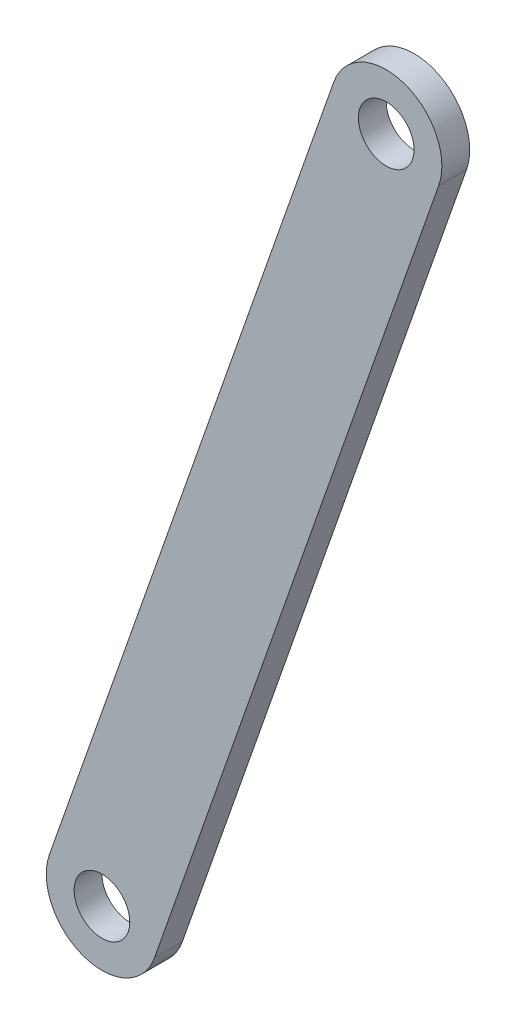
ISO-10303-21;
HEADER;
FILE_DESCRIPTION(('STEP AP214'),'2;1');
FILE_NAME('part.step','',(''),(''),'','','');
FILE_SCHEMA(('AUTOMOTIVE_DESIGN { 1 0 10303 214 1 1 1 1 }'));
ENDSEC;
DATA;
#1=APPLICATION_CONTEXT('core data for automotive mechanical design processes');
#2=APPLICATION_PROTOCOL_DEFINITION('international standard','automotive_design',2000,#1);
#3=PRODUCT_CONTEXT('',#1,'mechanical');
#4=PRODUCT('Part','Part','',(#3));
#5=PRODUCT_RELATED_PRODUCT_CATEGORY('part','',(#4));
#6=PRODUCT_DEFINITION_FORMATION('','',#4);
#7=PRODUCT_DEFINITION_CONTEXT('part definition',#1,'design');
#8=PRODUCT_DEFINITION('design','',#6,#7);
#9=PRODUCT_DEFINITION_SHAPE('','',#8);
#10=(LENGTH_UNIT() NAMED_UNIT(*) SI_UNIT(.MILLI.,.METRE.));
#11=(NAMED_UNIT(*) PLANE_ANGLE_UNIT() SI_UNIT($,.RADIAN.));
#12=(NAMED_UNIT(*) SI_UNIT($,.STERADIAN.) SOLID_ANGLE_UNIT());
#13=UNCERTAINTY_MEASURE_WITH_UNIT(LENGTH_MEASURE(1.E-05),#10,'distance_accuracy_value','');
#14=(GEOMETRIC_REPRESENTATION_CONTEXT(3) GLOBAL_UNCERTAINTY_ASSIGNED_CONTEXT((#13)) GLOBAL_UNIT_ASSIGNED_CONTEXT((#10,
#11,#12)) REPRESENTATION_CONTEXT('',''));
#15=CARTESIAN_POINT('',(0.,0.,0.));
#16=DIRECTION('',(0.,0.,1.));
#17=DIRECTION('',(1.,0.,0.));
#18=AXIS2_PLACEMENT_3D('',#15,#16,#17);
#19=CARTESIAN_POINT('',(-26.9521070315729,-45.5151701700811,-3.175));
#20=DIRECTION('',(0.,0.,1.));
#21=DIRECTION('',(1.,0.,0.));
#22=AXIS2_PLACEMENT_3D('',#19,#20,#21);
#23=CYLINDRICAL_SURFACE('',#22,3.175);
#24=CARTESIAN_POINT('',(-26.9521070315729,-45.5151701700811,-1.5875));
#25=DIRECTION('',(0.,0.,1.));
#26=DIRECTION('',(1.,0.,0.));
#27=AXIS2_PLACEMENT_3D('',#24,#25,#26);
#28=CIRCLE('',#27,3.175);
#29=CARTESIAN_POINT('',(-23.9558295468702,-46.5653826412809,-1.5875));
#30=VERTEX_POINT('',#29);
#31=CARTESIAN_POINT('',(-29.9483845162756,-44.4649576988814,-1.5875));
#32=VERTEX_POINT('',#31);
#33=EDGE_CURVE('E99',#30,#32,#28,.T.);
#34=ORIENTED_EDGE('',*,*,#33,.F.);
#35=DIRECTION('',(0.,0.,1.));
#36=VECTOR('',#35,1.);
#37=CARTESIAN_POINT('',(-23.9558295468702,-46.5653826412809,-3.175));
#38=LINE('',#37,#36);
#39=CARTESIAN_POINT('',(-23.9558295468702,-46.5653826412809,-3.175));
#40=VERTEX_POINT('',#39);
#41=EDGE_CURVE('E11',#40,#30,#38,.T.);
#42=ORIENTED_EDGE('',*,*,#41,.F.);
#43=CARTESIAN_POINT('',(-26.9521070315729,-45.5151701700811,-3.175));
#44=DIRECTION('',(0.,0.,1.));
#45=DIRECTION('',(1.,0.,0.));
#46=AXIS2_PLACEMENT_3D('',#43,#44,#45);
#47=CIRCLE('',#46,3.175);
#48=CARTESIAN_POINT('',(-29.9483845162756,-44.4649576988814,-3.175));
#49=VERTEX_POINT('',#48);
#50=EDGE_CURVE('E92',#40,#49,#47,.T.);
#51=ORIENTED_EDGE('',*,*,#50,.T.);
#52=DIRECTION('',(0.,0.,1.));
#53=VECTOR('',#52,1.);
#54=CARTESIAN_POINT('',(-29.9483845162756,-44.4649576988814,-3.175));
#55=LINE('',#54,#53);
#56=EDGE_CURVE('E37',#49,#32,#55,.T.);
#57=ORIENTED_EDGE('',*,*,#56,.T.);
#58=EDGE_LOOP('',(#34,#42,#51,#57));
#59=FACE_BOUND('',#58,.T.);
#60=ADVANCED_FACE('F34',(#59),#23,.T.);
#61=CARTESIAN_POINT('',(-23.9558295468702,-46.5653826412809,-3.175));
#62=DIRECTION('',(0.943709444000859,-0.330775581480239,0.));
#63=DIRECTION('',(0.330775581480239,0.943709444000859,0.));
#64=AXIS2_PLACEMENT_3D('',#61,#62,#63);
#65=PLANE('',#64);
#66=DIRECTION('',(0.330775581480239,0.943709444000859,0.));
#67=VECTOR('',#66,1.);
#68=CARTESIAN_POINT('',(-23.9558295468702,-46.5653826412809,-1.5875));
#69=LINE('',#68,#67);
#70=CARTESIAN_POINT('',(-40.1638330394019,-92.807145397323,-1.5875));
#71=VERTEX_POINT('',#70);
#72=EDGE_CURVE('E94',#71,#30,#69,.T.);
#73=ORIENTED_EDGE('',*,*,#72,.F.);
#74=DIRECTION('',(0.,0.,1.));
#75=VECTOR('',#74,1.);
#76=CARTESIAN_POINT('',(-40.1638330394019,-92.807145397323,-3.175));
#77=LINE('',#76,#75);
#78=CARTESIAN_POINT('',(-40.1638330394019,-92.807145397323,-3.175));
#79=VERTEX_POINT('',#78);
#80=EDGE_CURVE('E43',#79,#71,#77,.T.);
#81=ORIENTED_EDGE('',*,*,#80,.F.);
#82=DIRECTION('',(0.330775581480239,0.943709444000859,0.));
#83=VECTOR('',#82,1.);
#84=CARTESIAN_POINT('',(-23.9558295468702,-46.5653826412809,-3.175));
#85=LINE('',#84,#83);
#86=EDGE_CURVE('E89',#79,#40,#85,.T.);
#87=ORIENTED_EDGE('',*,*,#86,.T.);
#88=ORIENTED_EDGE('',*,*,#41,.T.);
#89=EDGE_LOOP('',(#73,#81,#87,#88));
#90=FACE_BOUND('',#89,.T.);
#91=ADVANCED_FACE('F110',(#90),#65,.T.);
#92=CARTESIAN_POINT('',(-43.1601105241046,-91.7569329261232,-3.175));
#93=DIRECTION('',(0.,0.,1.));
#94=DIRECTION('',(1.,0.,0.));
#95=AXIS2_PLACEMENT_3D('',#92,#93,#94);
#96=CYLINDRICAL_SURFACE('',#95,3.17499999999999);
#97=CARTESIAN_POINT('',(-43.1601105241046,-91.7569329261232,-1.5875));
#98=DIRECTION('',(0.,0.,1.));
#99=DIRECTION('',(1.,0.,0.));
#100=AXIS2_PLACEMENT_3D('',#97,#98,#99);
#101=CIRCLE('',#100,3.17499999999999);
#102=CARTESIAN_POINT('',(-46.1563880088073,-90.7067204549235,-1.5875));
#103=VERTEX_POINT('',#102);
#104=EDGE_CURVE('E84',#103,#71,#101,.T.);
#105=ORIENTED_EDGE('',*,*,#104,.F.);
#106=DIRECTION('',(0.,0.,1.));
#107=VECTOR('',#106,1.);
#108=CARTESIAN_POINT('',(-46.1563880088073,-90.7067204549235,-3.175));
#109=LINE('',#108,#107);
#110=CARTESIAN_POINT('',(-46.1563880088073,-90.7067204549235,-3.175));
#111=VERTEX_POINT('',#110);
#112=EDGE_CURVE('E79',#111,#103,#109,.T.);
#113=ORIENTED_EDGE('',*,*,#112,.F.);
#114=CARTESIAN_POINT('',(-43.1601105241046,-91.7569329261232,-3.175));
#115=DIRECTION('',(0.,0.,1.));
#116=DIRECTION('',(1.,0.,0.));
#117=AXIS2_PLACEMENT_3D('',#114,#115,#116);
#118=CIRCLE('',#117,3.17499999999999);
#119=EDGE_CURVE('E82',#111,#79,#118,.T.);
#120=ORIENTED_EDGE('',*,*,#119,.T.);
#121=ORIENTED_EDGE('',*,*,#80,.T.);
#122=EDGE_LOOP('',(#105,#113,#120,#121));
#123=FACE_BOUND('',#122,.T.);
#124=ADVANCED_FACE('F81',(#123),#96,.T.);
#125=CARTESIAN_POINT('',(-29.9483845162756,-44.4649576988814,-3.175));
#126=DIRECTION('',(-0.943709444000859,0.330775581480239,0.));
#127=DIRECTION('',(-0.330775581480239,-0.943709444000859,0.));
#128=AXIS2_PLACEMENT_3D('',#125,#126,#127);
#129=PLANE('',#128);
#130=DIRECTION('',(-0.330775581480239,-0.943709444000859,0.));
#131=VECTOR('',#130,1.);
#132=CARTESIAN_POINT('',(-29.9483845162756,-44.4649576988814,-1.5875));
#133=LINE('',#132,#131);
#134=EDGE_CURVE('E102',#32,#103,#133,.T.);
#135=ORIENTED_EDGE('',*,*,#134,.F.);
#136=ORIENTED_EDGE('',*,*,#56,.F.);
#137=DIRECTION('',(-0.330775581480239,-0.943709444000859,0.));
#138=VECTOR('',#137,1.);
#139=CARTESIAN_POINT('',(-29.9483845162756,-44.4649576988814,-3.175));
#140=LINE('',#139,#138);
#141=EDGE_CURVE('E88',#49,#111,#140,.T.);
#142=ORIENTED_EDGE('',*,*,#141,.T.);
#143=ORIENTED_EDGE('',*,*,#112,.T.);
#144=EDGE_LOOP('',(#135,#136,#142,#143));
#145=FACE_BOUND('',#144,.T.);
#146=ADVANCED_FACE('F91',(#145),#129,.T.);
#147=CARTESIAN_POINT('',(-26.9521070315729,-45.5151701700811,-3.175));
#148=DIRECTION('',(0.,0.,1.));
#149=DIRECTION('',(1.,0.,0.));
#150=AXIS2_PLACEMENT_3D('',#147,#148,#149);
#151=PLANE('',#150);
#152=CARTESIAN_POINT('',(-26.9521070315729,-45.5151701700811,-3.175));
#153=DIRECTION('',(0.,0.,1.));
#154=DIRECTION('',(1.,0.,0.));
#155=AXIS2_PLACEMENT_3D('',#152,#153,#154);
#156=CIRCLE('',#155,1.5875);
#157=CARTESIAN_POINT('',(-25.3646070315729,-45.5151701700811,-3.175));
#158=VERTEX_POINT('',#157);
#159=EDGE_CURVE('E143',#158,#158,#156,.T.);
#160=ORIENTED_EDGE('',*,*,#159,.T.);
#161=EDGE_LOOP('',(#160));
#162=FACE_BOUND('',#161,.T.);
#163=CARTESIAN_POINT('',(-43.1601105241046,-91.7569329261232,-3.175));
#164=DIRECTION('',(0.,0.,1.));
#165=DIRECTION('',(1.,0.,0.));
#166=AXIS2_PLACEMENT_3D('',#163,#164,#165);
#167=CIRCLE('',#166,1.5875);
#168=CARTESIAN_POINT('',(-41.5726105241046,-91.7569329261232,-3.175));
#169=VERTEX_POINT('',#168);
#170=EDGE_CURVE('E103',#169,#169,#167,.T.);
#171=ORIENTED_EDGE('',*,*,#170,.T.);
#172=EDGE_LOOP('',(#171));
#173=FACE_BOUND('',#172,.T.);
#174=ORIENTED_EDGE('',*,*,#50,.F.);
#175=ORIENTED_EDGE('',*,*,#86,.F.);
#176=ORIENTED_EDGE('',*,*,#119,.F.);
#177=ORIENTED_EDGE('',*,*,#141,.F.);
#178=EDGE_LOOP('',(#174,#175,#176,#177));
#179=FACE_BOUND('',#178,.T.);
#180=ADVANCED_FACE('F87',(#162,#173,#179),#151,.F.);
#181=CARTESIAN_POINT('',(-26.9521070315729,-45.5151701700811,-1.5875));
#182=DIRECTION('',(0.,0.,1.));
#183=DIRECTION('',(1.,0.,0.));
#184=AXIS2_PLACEMENT_3D('',#181,#182,#183);
#185=PLANE('',#184);
#186=CARTESIAN_POINT('',(-26.9521070315729,-45.5151701700811,-1.5875));
#187=DIRECTION('',(0.,0.,1.));
#188=DIRECTION('',(1.,0.,0.));
#189=AXIS2_PLACEMENT_3D('',#186,#187,#188);
#190=CIRCLE('',#189,1.5875);
#191=CARTESIAN_POINT('',(-25.3646070315729,-45.5151701700811,-1.5875));
#192=VERTEX_POINT('',#191);
#193=EDGE_CURVE('E146',#192,#192,#190,.T.);
#194=ORIENTED_EDGE('',*,*,#193,.F.);
#195=EDGE_LOOP('',(#194));
#196=FACE_BOUND('',#195,.T.);
#197=CARTESIAN_POINT('',(-43.1601105241046,-91.7569329261232,-1.5875));
#198=DIRECTION('',(0.,0.,1.));
#199=DIRECTION('',(1.,0.,0.));
#200=AXIS2_PLACEMENT_3D('',#197,#198,#199);
#201=CIRCLE('',#200,1.5875);
#202=CARTESIAN_POINT('',(-41.5726105241046,-91.7569329261232,-1.5875));
#203=VERTEX_POINT('',#202);
#204=EDGE_CURVE('E148',#203,#203,#201,.T.);
#205=ORIENTED_EDGE('',*,*,#204,.F.);
#206=EDGE_LOOP('',(#205));
#207=FACE_BOUND('',#206,.T.);
#208=ORIENTED_EDGE('',*,*,#33,.T.);
#209=ORIENTED_EDGE('',*,*,#134,.T.);
#210=ORIENTED_EDGE('',*,*,#104,.T.);
#211=ORIENTED_EDGE('',*,*,#72,.T.);
#212=EDGE_LOOP('',(#208,#209,#210,#211));
#213=FACE_BOUND('',#212,.T.);
#214=ADVANCED_FACE('F109',(#196,#207,#213),#185,.T.);
#215=CARTESIAN_POINT('',(-43.1601105241046,-91.7569329261232,-3.175));
#216=DIRECTION('',(0.,0.,1.));
#217=DIRECTION('',(1.,0.,0.));
#218=AXIS2_PLACEMENT_3D('',#215,#216,#217);
#219=CYLINDRICAL_SURFACE('',#218,1.5875);
#220=ORIENTED_EDGE('',*,*,#170,.F.);
#221=EDGE_LOOP('',(#220));
#222=FACE_BOUND('',#221,.T.);
#223=ORIENTED_EDGE('',*,*,#204,.T.);
#224=EDGE_LOOP('',(#223));
#225=FACE_BOUND('',#224,.T.);
#226=ADVANCED_FACE('F128',(#222,#225),#219,.F.);
#227=CARTESIAN_POINT('',(-26.9521070315729,-45.5151701700811,-3.175));
#228=DIRECTION('',(0.,0.,1.));
#229=DIRECTION('',(1.,0.,0.));
#230=AXIS2_PLACEMENT_3D('',#227,#228,#229);
#231=CYLINDRICAL_SURFACE('',#230,1.5875);
#232=ORIENTED_EDGE('',*,*,#159,.F.);
#233=EDGE_LOOP('',(#232));
#234=FACE_BOUND('',#233,.T.);
#235=ORIENTED_EDGE('',*,*,#193,.T.);
#236=EDGE_LOOP('',(#235));
#237=FACE_BOUND('',#236,.T.);
#238=ADVANCED_FACE('F135',(#234,#237),#231,.F.);
#239=CLOSED_SHELL('',(#60,#91,#124,#146,#180,#214,#226,#238));
#240=MANIFOLD_SOLID_BREP('B2',#239);
#241=ADVANCED_BREP_SHAPE_REPRESENTATION('',(#18,#240),#14);
#242=SHAPE_DEFINITION_REPRESENTATION(#9,#241);
ENDSEC;
END-ISO-10303-21;
